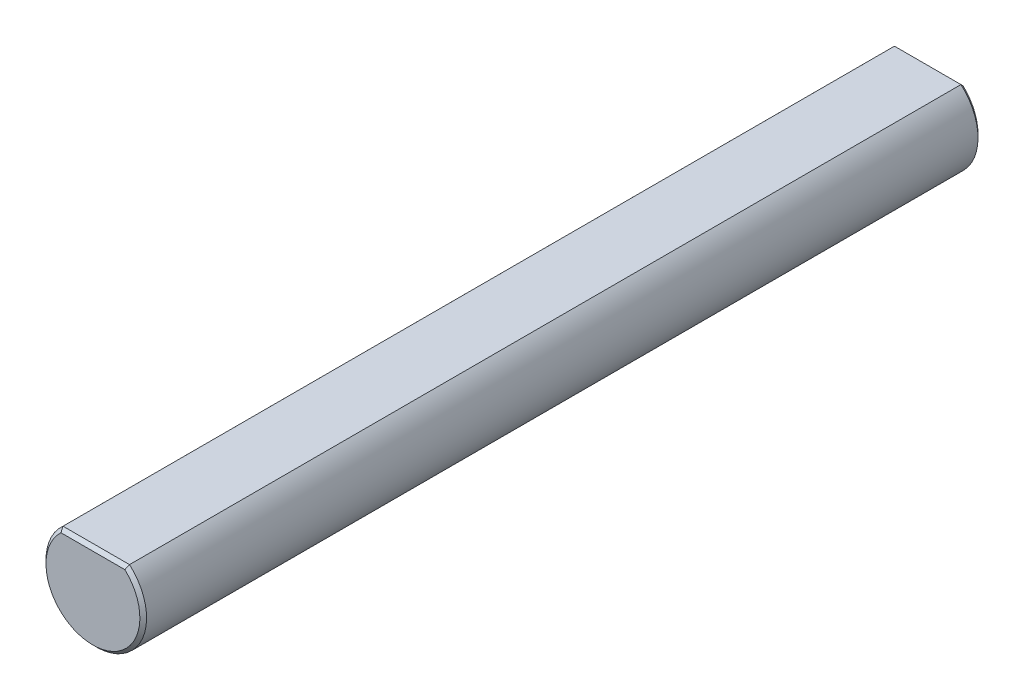
ISO-10303-21;
HEADER;
FILE_DESCRIPTION(('STEP AP214'),'2;1');
FILE_NAME('part.step','',(''),(''),'','','');
FILE_SCHEMA(('AUTOMOTIVE_DESIGN { 1 0 10303 214 1 1 1 1 }'));
ENDSEC;
DATA;
#1=APPLICATION_CONTEXT('core data for automotive mechanical design processes');
#2=APPLICATION_PROTOCOL_DEFINITION('international standard','automotive_design',2000,#1);
#3=PRODUCT_CONTEXT('',#1,'mechanical');
#4=PRODUCT('Part','Part','',(#3));
#5=PRODUCT_RELATED_PRODUCT_CATEGORY('part','',(#4));
#6=PRODUCT_DEFINITION_FORMATION('','',#4);
#7=PRODUCT_DEFINITION_CONTEXT('part definition',#1,'design');
#8=PRODUCT_DEFINITION('design','',#6,#7);
#9=PRODUCT_DEFINITION_SHAPE('','',#8);
#10=(LENGTH_UNIT() NAMED_UNIT(*) SI_UNIT(.MILLI.,.METRE.));
#11=(NAMED_UNIT(*) PLANE_ANGLE_UNIT() SI_UNIT($,.RADIAN.));
#12=(NAMED_UNIT(*) SI_UNIT($,.STERADIAN.) SOLID_ANGLE_UNIT());
#13=UNCERTAINTY_MEASURE_WITH_UNIT(LENGTH_MEASURE(1.E-05),#10,'distance_accuracy_value','');
#14=(GEOMETRIC_REPRESENTATION_CONTEXT(3) GLOBAL_UNCERTAINTY_ASSIGNED_CONTEXT((#13)) GLOBAL_UNIT_ASSIGNED_CONTEXT((#10,
#11,#12)) REPRESENTATION_CONTEXT('',''));
#15=CARTESIAN_POINT('',(0.,0.,0.));
#16=DIRECTION('',(0.,0.,1.));
#17=DIRECTION('',(1.,0.,0.));
#18=AXIS2_PLACEMENT_3D('',#15,#16,#17);
#19=CARTESIAN_POINT('',(0.,0.,2.00000000000001));
#20=DIRECTION('',(0.,0.,1.));
#21=DIRECTION('',(1.,0.,0.));
#22=AXIS2_PLACEMENT_3D('',#19,#20,#21);
#23=CYLINDRICAL_SURFACE('',#22,3.);
#24=DIRECTION('',(0.,0.,1.));
#25=VECTOR('',#24,1.);
#26=CARTESIAN_POINT('',(-1.98431348329844,2.25,2.00000000000001));
#27=LINE('',#26,#25);
#28=CARTESIAN_POINT('',(-1.98431348329844,2.25,2.19999999998058));
#29=VERTEX_POINT('',#28);
#30=CARTESIAN_POINT('',(-1.98431348329844,2.25,51.8000000000194));
#31=VERTEX_POINT('',#30);
#32=EDGE_CURVE('E93',#29,#31,#27,.T.);
#33=ORIENTED_EDGE('',*,*,#32,.F.);
#34=CARTESIAN_POINT('',(0.,0.,2.19999999998058));
#35=DIRECTION('',(0.,0.,1.));
#36=DIRECTION('',(1.,0.,0.));
#37=AXIS2_PLACEMENT_3D('',#34,#35,#36);
#38=CIRCLE('',#37,3.);
#39=CARTESIAN_POINT('',(1.98431348329844,2.25,2.19999999998058));
#40=VERTEX_POINT('',#39);
#41=EDGE_CURVE('E89',#29,#40,#38,.T.);
#42=ORIENTED_EDGE('',*,*,#41,.T.);
#43=DIRECTION('',(0.,0.,1.));
#44=VECTOR('',#43,1.);
#45=CARTESIAN_POINT('',(1.98431348329844,2.25,2.00000000000001));
#46=LINE('',#45,#44);
#47=CARTESIAN_POINT('',(1.98431348329844,2.25,51.8000000000194));
#48=VERTEX_POINT('',#47);
#49=EDGE_CURVE('E91',#40,#48,#46,.T.);
#50=ORIENTED_EDGE('',*,*,#49,.T.);
#51=CARTESIAN_POINT('',(0.,0.,51.8000000000194));
#52=DIRECTION('',(0.,0.,1.));
#53=DIRECTION('',(1.,0.,0.));
#54=AXIS2_PLACEMENT_3D('',#51,#52,#53);
#55=CIRCLE('',#54,3.);
#56=EDGE_CURVE('E99',#48,#31,#55,.F.);
#57=ORIENTED_EDGE('',*,*,#56,.T.);
#58=EDGE_LOOP('',(#33,#42,#50,#57));
#59=FACE_BOUND('',#58,.T.);
#60=ADVANCED_FACE('F39',(#59),#23,.T.);
#61=CARTESIAN_POINT('',(1.98431348329844,2.25,2.00000000000001));
#62=DIRECTION('',(0.,1.,0.));
#63=DIRECTION('',(0.,0.,1.));
#64=AXIS2_PLACEMENT_3D('',#61,#62,#63);
#65=PLANE('',#64);
#66=ORIENTED_EDGE('',*,*,#49,.F.);
#67=DIRECTION('',(-1.,0.,0.));
#68=VECTOR('',#67,1.);
#69=CARTESIAN_POINT('',(-1.98431348329844,2.25,2.19999999998058));
#70=LINE('',#69,#68);
#71=EDGE_CURVE('E105',#40,#29,#70,.T.);
#72=ORIENTED_EDGE('',*,*,#71,.T.);
#73=ORIENTED_EDGE('',*,*,#32,.T.);
#74=DIRECTION('',(1.,0.,0.));
#75=VECTOR('',#74,1.);
#76=CARTESIAN_POINT('',(1.98431348329844,2.25,51.8000000000194));
#77=LINE('',#76,#75);
#78=EDGE_CURVE('E106',#31,#48,#77,.T.);
#79=ORIENTED_EDGE('',*,*,#78,.T.);
#80=EDGE_LOOP('',(#66,#72,#73,#79));
#81=FACE_BOUND('',#80,.T.);
#82=ADVANCED_FACE('F103',(#81),#65,.T.);
#83=CARTESIAN_POINT('',(0.,0.,2.00000000000001));
#84=DIRECTION('',(0.,0.,1.));
#85=DIRECTION('',(1.,0.,0.));
#86=AXIS2_PLACEMENT_3D('',#83,#84,#85);
#87=PLANE('',#86);
#88=CARTESIAN_POINT('',(0.,0.,2.00000000000001));
#89=DIRECTION('',(0.,0.,1.));
#90=DIRECTION('',(1.,0.,0.));
#91=AXIS2_PLACEMENT_3D('',#88,#89,#90);
#92=CIRCLE('',#91,2.80000000001943);
#93=CARTESIAN_POINT('',(1.90722311228371,2.05000000001942,2.00000000000001));
#94=VERTEX_POINT('',#93);
#95=CARTESIAN_POINT('',(-1.90722311228371,2.05000000001942,2.00000000000001));
#96=VERTEX_POINT('',#95);
#97=EDGE_CURVE('E112',#94,#96,#92,.F.);
#98=ORIENTED_EDGE('',*,*,#97,.T.);
#99=DIRECTION('',(1.,0.,0.));
#100=VECTOR('',#99,1.);
#101=CARTESIAN_POINT('',(1.98431348329844,2.05000000001943,2.00000000000001));
#102=LINE('',#101,#100);
#103=EDGE_CURVE('E124',#96,#94,#102,.T.);
#104=ORIENTED_EDGE('',*,*,#103,.T.);
#105=EDGE_LOOP('',(#98,#104));
#106=FACE_BOUND('',#105,.T.);
#107=ADVANCED_FACE('F166',(#106),#87,.F.);
#108=CARTESIAN_POINT('',(0.,0.,52.));
#109=DIRECTION('',(0.,0.,1.));
#110=DIRECTION('',(1.,0.,0.));
#111=AXIS2_PLACEMENT_3D('',#108,#109,#110);
#112=PLANE('',#111);
#113=CARTESIAN_POINT('',(0.,0.,52.));
#114=DIRECTION('',(0.,0.,1.));
#115=DIRECTION('',(1.,0.,0.));
#116=AXIS2_PLACEMENT_3D('',#113,#114,#115);
#117=CIRCLE('',#116,2.8000000000194);
#118=CARTESIAN_POINT('',(-1.9072231122837,2.0500000000194,52.));
#119=VERTEX_POINT('',#118);
#120=CARTESIAN_POINT('',(1.9072231122837,2.0500000000194,52.));
#121=VERTEX_POINT('',#120);
#122=EDGE_CURVE('E54',#119,#121,#117,.T.);
#123=ORIENTED_EDGE('',*,*,#122,.T.);
#124=DIRECTION('',(-1.,0.,0.));
#125=VECTOR('',#124,1.);
#126=CARTESIAN_POINT('',(0.,2.0500000000194,52.));
#127=LINE('',#126,#125);
#128=EDGE_CURVE('E11',#121,#119,#127,.T.);
#129=ORIENTED_EDGE('',*,*,#128,.T.);
#130=EDGE_LOOP('',(#123,#129));
#131=FACE_BOUND('',#130,.T.);
#132=ADVANCED_FACE('F164',(#131),#112,.T.);
#133=CARTESIAN_POINT('',(0.,0.,2.19999999998058));
#134=DIRECTION('',(0.,0.,1.));
#135=DIRECTION('',(1.,0.,0.));
#136=AXIS2_PLACEMENT_3D('',#133,#134,#135);
#137=CONICAL_SURFACE('',#136,3.,0.785398163397443);
#138=CARTESIAN_POINT('',(-1.98431348329844,2.25,2.19999999998058));
#139=CARTESIAN_POINT('',(-1.9717019940292,2.2166210165585,2.16662101653908));
#140=CARTESIAN_POINT('',(-1.95897205323473,2.18326486179702,2.1332648617776));
#141=CARTESIAN_POINT('',(-1.93327526299967,2.11659819511694,2.06659819509752));
#142=CARTESIAN_POINT('',(-1.9203084134559,2.08328768321823,2.03328768319881));
#143=CARTESIAN_POINT('',(-1.90722311228373,2.05000000001942,2.00000000000001));
#144=B_SPLINE_CURVE_WITH_KNOTS('',3,(#138,#139,#140,#141,#142,#143),.UNSPECIFIED.,.F.,.F.,(4,2,
4),(0.,0.146580549944969,0.29316116372794),.UNSPECIFIED.);
#145=EDGE_CURVE('E117',#96,#29,#144,.F.);
#146=ORIENTED_EDGE('',*,*,#145,.F.);
#147=ORIENTED_EDGE('',*,*,#97,.F.);
#148=CARTESIAN_POINT('',(1.90722311228372,2.05000000001943,2.00000000000001));
#149=CARTESIAN_POINT('',(1.92030841345589,2.08328768321823,2.03328768319881));
#150=CARTESIAN_POINT('',(1.93327526299966,2.11659819511694,2.06659819509753));
#151=CARTESIAN_POINT('',(1.95897205323474,2.18326486179702,2.1332648617776));
#152=CARTESIAN_POINT('',(1.97170199402922,2.2166210165585,2.16662101653908));
#153=CARTESIAN_POINT('',(1.98431348329847,2.25,2.19999999998058));
#154=B_SPLINE_CURVE_WITH_KNOTS('',3,(#148,#149,#150,#151,#152,#153),.UNSPECIFIED.,.F.,.F.,(4,2,
4),(0.,0.146580613782971,0.293161163727939),.UNSPECIFIED.);
#155=EDGE_CURVE('E108',#40,#94,#154,.F.);
#156=ORIENTED_EDGE('',*,*,#155,.F.);
#157=ORIENTED_EDGE('',*,*,#41,.F.);
#158=EDGE_LOOP('',(#146,#147,#156,#157));
#159=FACE_BOUND('',#158,.T.);
#160=ADVANCED_FACE('F111',(#159),#137,.T.);
#161=CARTESIAN_POINT('',(1.98431348329844,2.25,2.19999999998058));
#162=DIRECTION('',(0.,0.707106781186551,-0.707106781186544));
#163=DIRECTION('',(1.,0.,0.));
#164=AXIS2_PLACEMENT_3D('',#161,#162,#163);
#165=PLANE('',#164);
#166=ORIENTED_EDGE('',*,*,#155,.T.);
#167=ORIENTED_EDGE('',*,*,#103,.F.);
#168=ORIENTED_EDGE('',*,*,#145,.T.);
#169=ORIENTED_EDGE('',*,*,#71,.F.);
#170=EDGE_LOOP('',(#166,#167,#168,#169));
#171=FACE_BOUND('',#170,.T.);
#172=ADVANCED_FACE('F119',(#171),#165,.T.);
#173=CARTESIAN_POINT('',(0.,0.,52.));
#174=DIRECTION('',(0.,0.,-1.));
#175=DIRECTION('',(-1.,0.,0.));
#176=AXIS2_PLACEMENT_3D('',#173,#174,#175);
#177=CONICAL_SURFACE('',#176,2.8000000000194,0.78539816339746);
#178=CARTESIAN_POINT('',(-1.90722311228371,2.0500000000194,52.));
#179=CARTESIAN_POINT('',(-1.92030841345589,2.08328768321821,51.9667123168012));
#180=CARTESIAN_POINT('',(-1.93327526299966,2.11659819511693,51.9334018049025));
#181=CARTESIAN_POINT('',(-1.95897205323474,2.18326486179701,51.8667351382224));
#182=CARTESIAN_POINT('',(-1.97170199402922,2.21662101655849,51.8333789834609));
#183=CARTESIAN_POINT('',(-1.98431348329847,2.24999999999999,51.8000000000194));
#184=B_SPLINE_CURVE_WITH_KNOTS('',3,(#178,#179,#180,#181,#182,#183),.UNSPECIFIED.,.F.,.F.,(4,2,
4),(0.,0.146580613782982,0.293161163727964),.UNSPECIFIED.);
#185=EDGE_CURVE('E67',#31,#119,#184,.F.);
#186=ORIENTED_EDGE('',*,*,#185,.F.);
#187=ORIENTED_EDGE('',*,*,#56,.F.);
#188=CARTESIAN_POINT('',(1.98431348329844,2.25,51.8000000000194));
#189=CARTESIAN_POINT('',(1.9717019940292,2.2166210165585,51.8333789834609));
#190=CARTESIAN_POINT('',(1.95897205323473,2.18326486179701,51.8667351382224));
#191=CARTESIAN_POINT('',(1.93327526299967,2.11659819511693,51.9334018049025));
#192=CARTESIAN_POINT('',(1.92030841345589,2.08328768321821,51.9667123168012));
#193=CARTESIAN_POINT('',(1.90722311228372,2.0500000000194,52.));
#194=B_SPLINE_CURVE_WITH_KNOTS('',3,(#188,#189,#190,#191,#192,#193),.UNSPECIFIED.,.F.,.F.,(4,2,
4),(0.,0.146580549944985,0.293161163727965),.UNSPECIFIED.);
#195=EDGE_CURVE('E44',#121,#48,#194,.F.);
#196=ORIENTED_EDGE('',*,*,#195,.F.);
#197=ORIENTED_EDGE('',*,*,#122,.F.);
#198=EDGE_LOOP('',(#186,#187,#196,#197));
#199=FACE_BOUND('',#198,.T.);
#200=ADVANCED_FACE('F149',(#199),#177,.T.);
#201=CARTESIAN_POINT('',(0.,2.0500000000194,52.));
#202=DIRECTION('',(0.,-0.707106781186539,-0.707106781186556));
#203=DIRECTION('',(-1.,0.,0.));
#204=AXIS2_PLACEMENT_3D('',#201,#202,#203);
#205=PLANE('',#204);
#206=ORIENTED_EDGE('',*,*,#195,.T.);
#207=ORIENTED_EDGE('',*,*,#78,.F.);
#208=ORIENTED_EDGE('',*,*,#185,.T.);
#209=ORIENTED_EDGE('',*,*,#128,.F.);
#210=EDGE_LOOP('',(#206,#207,#208,#209));
#211=FACE_BOUND('',#210,.T.);
#212=ADVANCED_FACE('F41',(#211),#205,.F.);
#213=CLOSED_SHELL('',(#60,#82,#107,#132,#160,#172,#200,#212));
#214=MANIFOLD_SOLID_BREP('B2',#213);
#215=ADVANCED_BREP_SHAPE_REPRESENTATION('',(#18,#214),#14);
#216=SHAPE_DEFINITION_REPRESENTATION(#9,#215);
ENDSEC;
END-ISO-10303-21;
